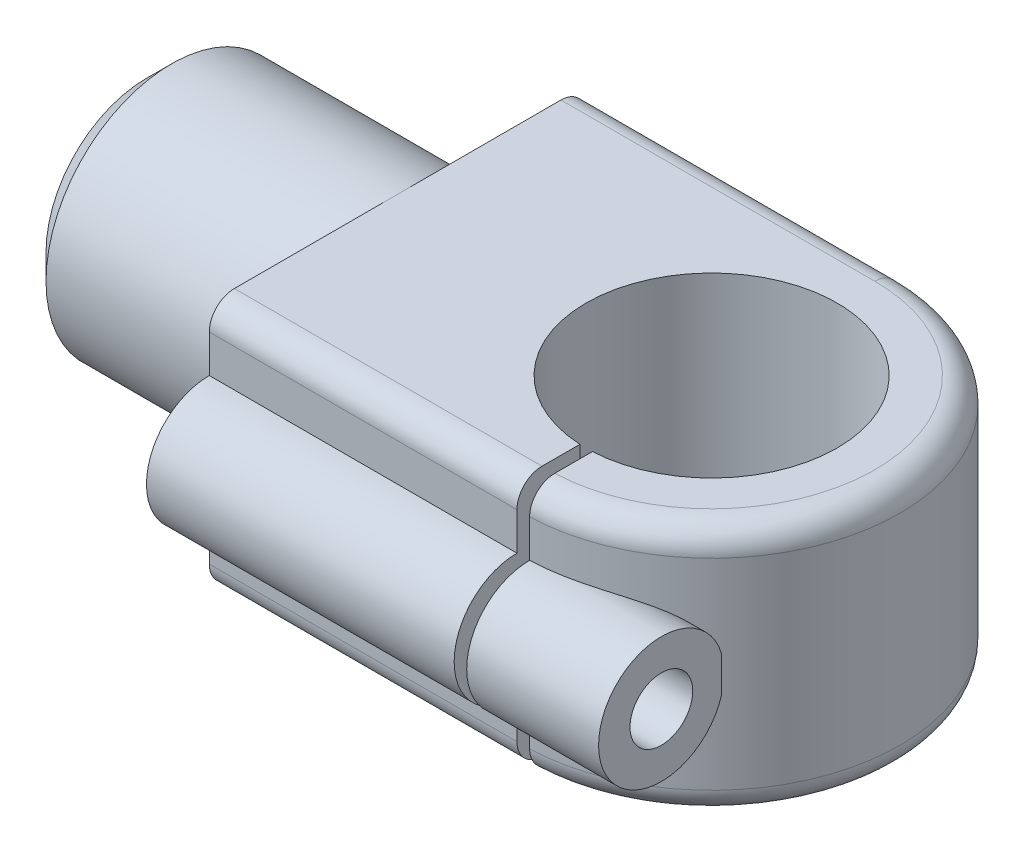
ISO-10303-21;
HEADER;
FILE_DESCRIPTION(('STEP AP214'),'2;1');
FILE_NAME('part.step','',(''),(''),'','','');
FILE_SCHEMA(('AUTOMOTIVE_DESIGN { 1 0 10303 214 1 1 1 1 }'));
ENDSEC;
DATA;
#1=APPLICATION_CONTEXT('core data for automotive mechanical design processes');
#2=APPLICATION_PROTOCOL_DEFINITION('international standard','automotive_design',2000,#1);
#3=PRODUCT_CONTEXT('',#1,'mechanical');
#4=PRODUCT('Part','Part','',(#3));
#5=PRODUCT_RELATED_PRODUCT_CATEGORY('part','',(#4));
#6=PRODUCT_DEFINITION_FORMATION('','',#4);
#7=PRODUCT_DEFINITION_CONTEXT('part definition',#1,'design');
#8=PRODUCT_DEFINITION('design','',#6,#7);
#9=PRODUCT_DEFINITION_SHAPE('','',#8);
#10=(LENGTH_UNIT() NAMED_UNIT(*) SI_UNIT(.MILLI.,.METRE.));
#11=(NAMED_UNIT(*) PLANE_ANGLE_UNIT() SI_UNIT($,.RADIAN.));
#12=(NAMED_UNIT(*) SI_UNIT($,.STERADIAN.) SOLID_ANGLE_UNIT());
#13=UNCERTAINTY_MEASURE_WITH_UNIT(LENGTH_MEASURE(1.E-05),#10,'distance_accuracy_value','');
#14=(GEOMETRIC_REPRESENTATION_CONTEXT(3) GLOBAL_UNCERTAINTY_ASSIGNED_CONTEXT((#13)) GLOBAL_UNIT_ASSIGNED_CONTEXT((#10,
#11,#12)) REPRESENTATION_CONTEXT('',''));
#15=CARTESIAN_POINT('',(0.,0.,0.));
#16=DIRECTION('',(0.,0.,1.));
#17=DIRECTION('',(1.,0.,0.));
#18=AXIS2_PLACEMENT_3D('',#15,#16,#17);
#19=CARTESIAN_POINT('',(0.,20.,0.));
#20=DIRECTION('',(0.,1.,0.));
#21=DIRECTION('',(0.,0.,1.));
#22=AXIS2_PLACEMENT_3D('',#19,#20,#21);
#23=PLANE('',#22);
#24=DIRECTION('',(0.,0.,-1.));
#25=VECTOR('',#24,1.);
#26=CARTESIAN_POINT('',(-25.,20.,0.));
#27=LINE('',#26,#25);
#28=CARTESIAN_POINT('',(-25.,20.,0.));
#29=VERTEX_POINT('',#28);
#30=CARTESIAN_POINT('',(-25.,20.,-13.));
#31=VERTEX_POINT('',#30);
#32=EDGE_CURVE('E181',#29,#31,#27,.T.);
#33=ORIENTED_EDGE('',*,*,#32,.F.);
#34=DIRECTION('',(0.,0.,-1.));
#35=VECTOR('',#34,1.);
#36=CARTESIAN_POINT('',(-25.,20.,0.));
#37=LINE('',#36,#35);
#38=CARTESIAN_POINT('',(-25.,20.,13.));
#39=VERTEX_POINT('',#38);
#40=EDGE_CURVE('E173',#39,#29,#37,.T.);
#41=ORIENTED_EDGE('',*,*,#40,.F.);
#42=DIRECTION('',(1.,0.,0.));
#43=VECTOR('',#42,1.);
#44=CARTESIAN_POINT('',(-0.5,20.,13.));
#45=LINE('',#44,#43);
#46=CARTESIAN_POINT('',(-0.5,20.,13.));
#47=VERTEX_POINT('',#46);
#48=EDGE_CURVE('E313',#39,#47,#45,.T.);
#49=ORIENTED_EDGE('',*,*,#48,.T.);
#50=DIRECTION('',(0.,0.,-1.));
#51=VECTOR('',#50,1.);
#52=CARTESIAN_POINT('',(-0.5,20.,0.));
#53=LINE('',#52,#51);
#54=CARTESIAN_POINT('',(-0.5,20.,9.98749217771909));
#55=VERTEX_POINT('',#54);
#56=EDGE_CURVE('E359',#47,#55,#53,.T.);
#57=ORIENTED_EDGE('',*,*,#56,.T.);
#58=CARTESIAN_POINT('',(0.,20.,0.));
#59=DIRECTION('',(0.,1.,0.));
#60=DIRECTION('',(0.,0.,1.));
#61=AXIS2_PLACEMENT_3D('',#58,#59,#60);
#62=CIRCLE('',#61,10.);
#63=CARTESIAN_POINT('',(0.5,20.,9.98749217771909));
#64=VERTEX_POINT('',#63);
#65=EDGE_CURVE('E363',#64,#55,#62,.T.);
#66=ORIENTED_EDGE('',*,*,#65,.F.);
#67=DIRECTION('',(0.,0.,-1.));
#68=VECTOR('',#67,1.);
#69=CARTESIAN_POINT('',(0.5,20.,0.));
#70=LINE('',#69,#68);
#71=CARTESIAN_POINT('',(0.5,20.,12.9903810567666));
#72=VERTEX_POINT('',#71);
#73=EDGE_CURVE('E361',#72,#64,#70,.T.);
#74=ORIENTED_EDGE('',*,*,#73,.F.);
#75=CARTESIAN_POINT('',(0.,20.,0.));
#76=DIRECTION('',(0.,1.,0.));
#77=DIRECTION('',(0.,0.,1.));
#78=AXIS2_PLACEMENT_3D('',#75,#76,#77);
#79=CIRCLE('',#78,13.);
#80=CARTESIAN_POINT('',(0.,20.,-13.));
#81=VERTEX_POINT('',#80);
#82=EDGE_CURVE('E306',#72,#81,#79,.T.);
#83=ORIENTED_EDGE('',*,*,#82,.T.);
#84=DIRECTION('',(-1.,0.,0.));
#85=VECTOR('',#84,1.);
#86=CARTESIAN_POINT('',(-30.,20.,-13.));
#87=LINE('',#86,#85);
#88=EDGE_CURVE('E186',#81,#31,#87,.T.);
#89=ORIENTED_EDGE('',*,*,#88,.T.);
#90=EDGE_LOOP('',(#33,#41,#49,#57,#66,#74,#83,#89));
#91=FACE_BOUND('',#90,.T.);
#92=ADVANCED_FACE('F41',(#91),#23,.T.);
#93=CARTESIAN_POINT('',(0.,0.,0.));
#94=DIRECTION('',(0.,1.,0.));
#95=DIRECTION('',(0.,0.,1.));
#96=AXIS2_PLACEMENT_3D('',#93,#94,#95);
#97=PLANE('',#96);
#98=DIRECTION('',(0.,0.,1.));
#99=VECTOR('',#98,1.);
#100=CARTESIAN_POINT('',(-25.,0.,0.));
#101=LINE('',#100,#99);
#102=CARTESIAN_POINT('',(-25.,0.,0.));
#103=VERTEX_POINT('',#102);
#104=CARTESIAN_POINT('',(-25.,0.,13.));
#105=VERTEX_POINT('',#104);
#106=EDGE_CURVE('E168',#103,#105,#101,.T.);
#107=ORIENTED_EDGE('',*,*,#106,.F.);
#108=DIRECTION('',(0.,0.,1.));
#109=VECTOR('',#108,1.);
#110=CARTESIAN_POINT('',(-25.,0.,0.));
#111=LINE('',#110,#109);
#112=CARTESIAN_POINT('',(-25.,0.,-13.));
#113=VERTEX_POINT('',#112);
#114=EDGE_CURVE('E188',#113,#103,#111,.T.);
#115=ORIENTED_EDGE('',*,*,#114,.F.);
#116=DIRECTION('',(-1.,0.,0.));
#117=VECTOR('',#116,1.);
#118=CARTESIAN_POINT('',(0.,0.,-13.));
#119=LINE('',#118,#117);
#120=CARTESIAN_POINT('',(0.,0.,-13.));
#121=VERTEX_POINT('',#120);
#122=EDGE_CURVE('E302',#113,#121,#119,.F.);
#123=ORIENTED_EDGE('',*,*,#122,.T.);
#124=CARTESIAN_POINT('',(0.,0.,0.));
#125=DIRECTION('',(0.,1.,0.));
#126=DIRECTION('',(0.,0.,1.));
#127=AXIS2_PLACEMENT_3D('',#124,#125,#126);
#128=CIRCLE('',#127,13.);
#129=CARTESIAN_POINT('',(0.5,0.,12.9903810567666));
#130=VERTEX_POINT('',#129);
#131=EDGE_CURVE('E298',#121,#130,#128,.F.);
#132=ORIENTED_EDGE('',*,*,#131,.T.);
#133=DIRECTION('',(0.,0.,-1.));
#134=VECTOR('',#133,1.);
#135=CARTESIAN_POINT('',(0.5,0.,0.));
#136=LINE('',#135,#134);
#137=CARTESIAN_POINT('',(0.5,0.,9.98749217771909));
#138=VERTEX_POINT('',#137);
#139=EDGE_CURVE('E377',#130,#138,#136,.T.);
#140=ORIENTED_EDGE('',*,*,#139,.T.);
#141=CARTESIAN_POINT('',(0.,0.,0.));
#142=DIRECTION('',(0.,1.,0.));
#143=DIRECTION('',(0.,0.,1.));
#144=AXIS2_PLACEMENT_3D('',#141,#142,#143);
#145=CIRCLE('',#144,10.);
#146=CARTESIAN_POINT('',(-0.5,0.,9.98749217771909));
#147=VERTEX_POINT('',#146);
#148=EDGE_CURVE('E385',#138,#147,#145,.T.);
#149=ORIENTED_EDGE('',*,*,#148,.T.);
#150=DIRECTION('',(0.,0.,-1.));
#151=VECTOR('',#150,1.);
#152=CARTESIAN_POINT('',(-0.5,0.,0.));
#153=LINE('',#152,#151);
#154=CARTESIAN_POINT('',(-0.5,0.,13.));
#155=VERTEX_POINT('',#154);
#156=EDGE_CURVE('E366',#155,#147,#153,.T.);
#157=ORIENTED_EDGE('',*,*,#156,.F.);
#158=DIRECTION('',(1.,0.,0.));
#159=VECTOR('',#158,1.);
#160=CARTESIAN_POINT('',(0.,0.,13.));
#161=LINE('',#160,#159);
#162=EDGE_CURVE('E301',#155,#105,#161,.F.);
#163=ORIENTED_EDGE('',*,*,#162,.T.);
#164=EDGE_LOOP('',(#107,#115,#123,#132,#140,#149,#157,#163));
#165=FACE_BOUND('',#164,.T.);
#166=ADVANCED_FACE('F246',(#165),#97,.F.);
#167=CARTESIAN_POINT('',(11.,10.,15.));
#168=DIRECTION('',(-1.,0.,0.));
#169=DIRECTION('',(0.,0.,1.));
#170=AXIS2_PLACEMENT_3D('',#167,#168,#169);
#171=CYLINDRICAL_SURFACE('',#170,5.);
#172=DIRECTION('',(-1.,0.,0.));
#173=VECTOR('',#172,1.);
#174=CARTESIAN_POINT('',(11.,15.,15.));
#175=LINE('',#174,#173);
#176=CARTESIAN_POINT('',(-25.,15.,15.));
#177=VERTEX_POINT('',#176);
#178=CARTESIAN_POINT('',(-0.5,15.,15.));
#179=VERTEX_POINT('',#178);
#180=EDGE_CURVE('E213',#177,#179,#175,.F.);
#181=ORIENTED_EDGE('',*,*,#180,.F.);
#182=CARTESIAN_POINT('',(-25.,10.,15.));
#183=DIRECTION('',(-1.,0.,0.));
#184=DIRECTION('',(0.,0.,1.));
#185=AXIS2_PLACEMENT_3D('',#182,#183,#184);
#186=CIRCLE('',#185,5.);
#187=CARTESIAN_POINT('',(-25.,5.,15.));
#188=VERTEX_POINT('',#187);
#189=EDGE_CURVE('E455',#188,#177,#186,.T.);
#190=ORIENTED_EDGE('',*,*,#189,.F.);
#191=DIRECTION('',(-1.,0.,0.));
#192=VECTOR('',#191,1.);
#193=CARTESIAN_POINT('',(11.,5.,15.));
#194=LINE('',#193,#192);
#195=CARTESIAN_POINT('',(-0.5,5.,15.));
#196=VERTEX_POINT('',#195);
#197=EDGE_CURVE('E214',#196,#188,#194,.T.);
#198=ORIENTED_EDGE('',*,*,#197,.F.);
#199=CARTESIAN_POINT('',(-0.5,10.,15.));
#200=DIRECTION('',(-1.,0.,0.));
#201=DIRECTION('',(0.,0.,1.));
#202=AXIS2_PLACEMENT_3D('',#199,#200,#201);
#203=CIRCLE('',#202,5.);
#204=EDGE_CURVE('E294',#179,#196,#203,.F.);
#205=ORIENTED_EDGE('',*,*,#204,.F.);
#206=EDGE_LOOP('',(#181,#190,#198,#205));
#207=FACE_BOUND('',#206,.T.);
#208=ADVANCED_FACE('F241',(#207),#171,.T.);
#209=CARTESIAN_POINT('',(0.,20.,15.));
#210=DIRECTION('',(0.,0.,-1.));
#211=DIRECTION('',(-1.,0.,0.));
#212=AXIS2_PLACEMENT_3D('',#209,#210,#211);
#213=PLANE('',#212);
#214=DIRECTION('',(0.,1.,0.));
#215=VECTOR('',#214,1.);
#216=CARTESIAN_POINT('',(-25.,0.,15.));
#217=LINE('',#216,#215);
#218=CARTESIAN_POINT('',(-25.,2.,15.));
#219=VERTEX_POINT('',#218);
#220=EDGE_CURVE('E454',#219,#188,#217,.T.);
#221=ORIENTED_EDGE('',*,*,#220,.F.);
#222=DIRECTION('',(1.,0.,0.));
#223=VECTOR('',#222,1.);
#224=CARTESIAN_POINT('',(0.,2.,15.));
#225=LINE('',#224,#223);
#226=CARTESIAN_POINT('',(-0.5,2.,15.));
#227=VERTEX_POINT('',#226);
#228=EDGE_CURVE('E319',#219,#227,#225,.T.);
#229=ORIENTED_EDGE('',*,*,#228,.T.);
#230=DIRECTION('',(0.,-1.,0.));
#231=VECTOR('',#230,1.);
#232=CARTESIAN_POINT('',(-0.5,20.,15.));
#233=LINE('',#232,#231);
#234=EDGE_CURVE('E371',#196,#227,#233,.T.);
#235=ORIENTED_EDGE('',*,*,#234,.F.);
#236=ORIENTED_EDGE('',*,*,#197,.T.);
#237=EDGE_LOOP('',(#221,#229,#235,#236));
#238=FACE_BOUND('',#237,.T.);
#239=ADVANCED_FACE('F265',(#238),#213,.F.);
#240=DIRECTION('',(0.,1.,0.));
#241=VECTOR('',#240,1.);
#242=CARTESIAN_POINT('',(-25.,0.,15.));
#243=LINE('',#242,#241);
#244=CARTESIAN_POINT('',(-25.,18.,15.));
#245=VERTEX_POINT('',#244);
#246=EDGE_CURVE('E459',#177,#245,#243,.T.);
#247=ORIENTED_EDGE('',*,*,#246,.F.);
#248=ORIENTED_EDGE('',*,*,#180,.T.);
#249=CARTESIAN_POINT('',(-0.5,18.,15.));
#250=VERTEX_POINT('',#249);
#251=EDGE_CURVE('E383',#250,#179,#233,.T.);
#252=ORIENTED_EDGE('',*,*,#251,.F.);
#253=DIRECTION('',(1.,0.,0.));
#254=VECTOR('',#253,1.);
#255=CARTESIAN_POINT('',(-30.,18.,15.));
#256=LINE('',#255,#254);
#257=EDGE_CURVE('E320',#250,#245,#256,.F.);
#258=ORIENTED_EDGE('',*,*,#257,.T.);
#259=EDGE_LOOP('',(#247,#248,#252,#258));
#260=FACE_BOUND('',#259,.T.);
#261=ADVANCED_FACE('F262',(#260),#213,.F.);
#262=CARTESIAN_POINT('',(0.,18.,13.));
#263=DIRECTION('',(-1.,0.,0.));
#264=DIRECTION('',(0.,0.,1.));
#265=AXIS2_PLACEMENT_3D('',#262,#263,#264);
#266=CYLINDRICAL_SURFACE('',#265,2.);
#267=ORIENTED_EDGE('',*,*,#48,.F.);
#268=CARTESIAN_POINT('',(-25.,18.,13.));
#269=DIRECTION('',(-1.,0.,0.));
#270=DIRECTION('',(0.,0.,1.));
#271=AXIS2_PLACEMENT_3D('',#268,#269,#270);
#272=CIRCLE('',#271,2.);
#273=EDGE_CURVE('E178',#245,#39,#272,.T.);
#274=ORIENTED_EDGE('',*,*,#273,.F.);
#275=ORIENTED_EDGE('',*,*,#257,.F.);
#276=CARTESIAN_POINT('',(-0.5,18.,13.));
#277=DIRECTION('',(-1.,0.,0.));
#278=DIRECTION('',(0.,0.,1.));
#279=AXIS2_PLACEMENT_3D('',#276,#277,#278);
#280=CIRCLE('',#279,2.);
#281=EDGE_CURVE('E312',#47,#250,#280,.F.);
#282=ORIENTED_EDGE('',*,*,#281,.F.);
#283=EDGE_LOOP('',(#267,#274,#275,#282));
#284=FACE_BOUND('',#283,.T.);
#285=ADVANCED_FACE('F279',(#284),#266,.T.);
#286=CARTESIAN_POINT('',(0.,2.,13.));
#287=DIRECTION('',(1.,0.,0.));
#288=DIRECTION('',(0.,0.,-1.));
#289=AXIS2_PLACEMENT_3D('',#286,#287,#288);
#290=CYLINDRICAL_SURFACE('',#289,2.);
#291=ORIENTED_EDGE('',*,*,#228,.F.);
#292=CARTESIAN_POINT('',(-25.,2.,13.));
#293=DIRECTION('',(-1.,0.,0.));
#294=DIRECTION('',(0.,0.,1.));
#295=AXIS2_PLACEMENT_3D('',#292,#293,#294);
#296=CIRCLE('',#295,2.);
#297=EDGE_CURVE('E446',#105,#219,#296,.T.);
#298=ORIENTED_EDGE('',*,*,#297,.F.);
#299=ORIENTED_EDGE('',*,*,#162,.F.);
#300=CARTESIAN_POINT('',(-0.5,2.,13.));
#301=DIRECTION('',(-1.,0.,0.));
#302=DIRECTION('',(0.,0.,1.));
#303=AXIS2_PLACEMENT_3D('',#300,#301,#302);
#304=CIRCLE('',#303,2.);
#305=EDGE_CURVE('E311',#227,#155,#304,.F.);
#306=ORIENTED_EDGE('',*,*,#305,.F.);
#307=EDGE_LOOP('',(#291,#298,#299,#306));
#308=FACE_BOUND('',#307,.T.);
#309=ADVANCED_FACE('F267',(#308),#290,.T.);
#310=CARTESIAN_POINT('',(0.,20.,-15.));
#311=DIRECTION('',(0.,0.,1.));
#312=DIRECTION('',(1.,0.,0.));
#313=AXIS2_PLACEMENT_3D('',#310,#311,#312);
#314=PLANE('',#313);
#315=DIRECTION('',(0.,-1.,0.));
#316=VECTOR('',#315,1.);
#317=CARTESIAN_POINT('',(-25.,0.,-15.));
#318=LINE('',#317,#316);
#319=CARTESIAN_POINT('',(-25.,18.,-15.));
#320=VERTEX_POINT('',#319);
#321=CARTESIAN_POINT('',(-25.,2.,-15.));
#322=VERTEX_POINT('',#321);
#323=EDGE_CURVE('E284',#320,#322,#318,.T.);
#324=ORIENTED_EDGE('',*,*,#323,.F.);
#325=DIRECTION('',(-1.,0.,0.));
#326=VECTOR('',#325,1.);
#327=CARTESIAN_POINT('',(0.,18.,-15.));
#328=LINE('',#327,#326);
#329=CARTESIAN_POINT('',(0.,18.,-15.));
#330=VERTEX_POINT('',#329);
#331=EDGE_CURVE('E281',#320,#330,#328,.F.);
#332=ORIENTED_EDGE('',*,*,#331,.T.);
#333=DIRECTION('',(0.,-1.,0.));
#334=VECTOR('',#333,1.);
#335=CARTESIAN_POINT('',(0.,20.,-15.));
#336=LINE('',#335,#334);
#337=CARTESIAN_POINT('',(0.,2.,-15.));
#338=VERTEX_POINT('',#337);
#339=EDGE_CURVE('E390',#330,#338,#336,.T.);
#340=ORIENTED_EDGE('',*,*,#339,.T.);
#341=DIRECTION('',(-1.,0.,0.));
#342=VECTOR('',#341,1.);
#343=CARTESIAN_POINT('',(0.,2.,-15.));
#344=LINE('',#343,#342);
#345=EDGE_CURVE('E289',#338,#322,#344,.T.);
#346=ORIENTED_EDGE('',*,*,#345,.T.);
#347=EDGE_LOOP('',(#324,#332,#340,#346));
#348=FACE_BOUND('',#347,.T.);
#349=ADVANCED_FACE('F266',(#348),#314,.F.);
#350=CARTESIAN_POINT('',(0.,2.,-13.));
#351=DIRECTION('',(-1.,0.,0.));
#352=DIRECTION('',(0.,0.,1.));
#353=AXIS2_PLACEMENT_3D('',#350,#351,#352);
#354=CYLINDRICAL_SURFACE('',#353,2.);
#355=ORIENTED_EDGE('',*,*,#122,.F.);
#356=CARTESIAN_POINT('',(-25.,2.,-13.));
#357=DIRECTION('',(-1.,0.,0.));
#358=DIRECTION('',(0.,0.,1.));
#359=AXIS2_PLACEMENT_3D('',#356,#357,#358);
#360=CIRCLE('',#359,2.);
#361=EDGE_CURVE('E290',#322,#113,#360,.T.);
#362=ORIENTED_EDGE('',*,*,#361,.F.);
#363=ORIENTED_EDGE('',*,*,#345,.F.);
#364=CARTESIAN_POINT('',(0.,2.,-13.));
#365=DIRECTION('',(-1.,0.,0.));
#366=DIRECTION('',(0.,-1.,0.));
#367=AXIS2_PLACEMENT_3D('',#364,#365,#366);
#368=CIRCLE('',#367,2.);
#369=EDGE_CURVE('E204',#338,#121,#368,.T.);
#370=ORIENTED_EDGE('',*,*,#369,.T.);
#371=EDGE_LOOP('',(#355,#362,#363,#370));
#372=FACE_BOUND('',#371,.T.);
#373=ADVANCED_FACE('F268',(#372),#354,.T.);
#374=CARTESIAN_POINT('',(0.,18.,-13.));
#375=DIRECTION('',(1.,0.,0.));
#376=DIRECTION('',(0.,0.,-1.));
#377=AXIS2_PLACEMENT_3D('',#374,#375,#376);
#378=CYLINDRICAL_SURFACE('',#377,2.);
#379=ORIENTED_EDGE('',*,*,#331,.F.);
#380=CARTESIAN_POINT('',(-25.,18.,-13.));
#381=DIRECTION('',(-1.,0.,0.));
#382=DIRECTION('',(0.,0.,1.));
#383=AXIS2_PLACEMENT_3D('',#380,#381,#382);
#384=CIRCLE('',#383,2.);
#385=EDGE_CURVE('E193',#31,#320,#384,.T.);
#386=ORIENTED_EDGE('',*,*,#385,.F.);
#387=ORIENTED_EDGE('',*,*,#88,.F.);
#388=CARTESIAN_POINT('',(0.,18.,-13.));
#389=DIRECTION('',(-1.,0.,0.));
#390=DIRECTION('',(0.,0.,1.));
#391=AXIS2_PLACEMENT_3D('',#388,#389,#390);
#392=CIRCLE('',#391,2.);
#393=EDGE_CURVE('E192',#81,#330,#392,.T.);
#394=ORIENTED_EDGE('',*,*,#393,.T.);
#395=EDGE_LOOP('',(#379,#386,#387,#394));
#396=FACE_BOUND('',#395,.T.);
#397=ADVANCED_FACE('F274',(#396),#378,.T.);
#398=CARTESIAN_POINT('',(0.5,20.,0.));
#399=DIRECTION('',(-1.,0.,0.));
#400=DIRECTION('',(0.,0.,1.));
#401=AXIS2_PLACEMENT_3D('',#398,#399,#400);
#402=PLANE('',#401);
#403=CARTESIAN_POINT('',(0.5,10.,15.));
#404=DIRECTION('',(-1.,0.,0.));
#405=DIRECTION('',(0.,0.,1.));
#406=AXIS2_PLACEMENT_3D('',#403,#404,#405);
#407=CIRCLE('',#406,2.5);
#408=CARTESIAN_POINT('',(0.5,10.,17.5));
#409=VERTEX_POINT('',#408);
#410=EDGE_CURVE('E210',#409,#409,#407,.T.);
#411=ORIENTED_EDGE('',*,*,#410,.F.);
#412=EDGE_LOOP('',(#411));
#413=FACE_BOUND('',#412,.T.);
#414=ORIENTED_EDGE('',*,*,#139,.F.);
#415=CARTESIAN_POINT('',(0.5,0.,12.9903810567666));
#416=CARTESIAN_POINT('',(0.5,3.9474154008824E-07,13.0467150452053));
#417=CARTESIAN_POINT('',(0.5,0.00237810851266362,13.103022076195));
#418=CARTESIAN_POINT('',(0.5,0.0118641897622879,13.215233562011));
#419=CARTESIAN_POINT('',(0.5,0.0189723412082146,13.2711380351036));
#420=CARTESIAN_POINT('',(0.5,0.0473260310628624,13.4375517851217));
#421=CARTESIAN_POINT('',(0.5,0.0756009864726571,13.5469468675122));
#422=CARTESIAN_POINT('',(0.5,0.150116828889387,13.759434911907));
#423=CARTESIAN_POINT('',(0.5,0.196366540729273,13.8625247494893));
#424=CARTESIAN_POINT('',(0.5,0.305518473808404,14.0594686849897));
#425=CARTESIAN_POINT('',(0.5,0.36841763608513,14.1533244751162));
#426=CARTESIAN_POINT('',(0.5,0.5090593195644,14.329096210817));
#427=CARTESIAN_POINT('',(0.5,0.586795865286165,14.4110169396758));
#428=CARTESIAN_POINT('',(0.5,0.754945090825614,14.5606526498705));
#429=CARTESIAN_POINT('',(0.5,0.845360238454905,14.6283648591851));
#430=CARTESIAN_POINT('',(0.5,1.03623337964804,14.7476054138702));
#431=CARTESIAN_POINT('',(0.5,1.13668716525642,14.7991405030972));
#432=CARTESIAN_POINT('',(0.5,1.34480385558574,14.8845781561183));
#433=CARTESIAN_POINT('',(0.5,1.45246243486213,14.9184911941124));
#434=CARTESIAN_POINT('',(0.5,1.63398864538022,14.9592514641663));
#435=CARTESIAN_POINT('',(0.5,1.70671025517,14.9713989770526));
#436=CARTESIAN_POINT('',(0.5,1.85294436952205,14.9876043045346));
#437=CARTESIAN_POINT('',(0.5,1.92645560245249,14.9916735975551));
#438=CARTESIAN_POINT('',(0.5,2.,14.9916643505649));
#439=B_SPLINE_CURVE_WITH_KNOTS('',3,(#415,#416,#417,#418,#419,#420,#421,#422,#423,#424,#425,
#426,#427,#428,#429,#430,#431,#432,#433,#434,#435,#436,#437,#438),.UNSPECIFIED.,.F.,.F.,(4,2,2,
2,2,2,2,2,2,2,2,4),(0.,0.168898237005139,0.337788761189665,0.675020464450288,1.01241794356334,
1.34975347644329,1.6869534392658,2.02421912732002,2.36134403003656,2.69826832248159,
2.91903835864936,3.13949447525757),.UNSPECIFIED.);
#440=CARTESIAN_POINT('',(0.5,2.,14.9916643505649));
#441=VERTEX_POINT('',#440);
#442=EDGE_CURVE('E57',#130,#441,#439,.T.);
#443=ORIENTED_EDGE('',*,*,#442,.T.);
#444=DIRECTION('',(0.,-1.,0.));
#445=VECTOR('',#444,1.);
#446=CARTESIAN_POINT('',(0.5,20.,14.9916643505649));
#447=LINE('',#446,#445);
#448=CARTESIAN_POINT('',(0.5,5.00000694830998,14.9916643505649));
#449=VERTEX_POINT('',#448);
#450=EDGE_CURVE('E386',#449,#441,#447,.T.);
#451=ORIENTED_EDGE('',*,*,#450,.F.);
#452=CARTESIAN_POINT('',(0.5,10.,15.));
#453=DIRECTION('',(1.,0.,0.));
#454=DIRECTION('',(0.,0.,-1.));
#455=AXIS2_PLACEMENT_3D('',#452,#453,#454);
#456=CIRCLE('',#455,5.);
#457=CARTESIAN_POINT('',(0.5,14.99999305169,14.9916643505649));
#458=VERTEX_POINT('',#457);
#459=EDGE_CURVE('E297',#449,#458,#456,.F.);
#460=ORIENTED_EDGE('',*,*,#459,.T.);
#461=CARTESIAN_POINT('',(0.5,18.,14.9916643505649));
#462=VERTEX_POINT('',#461);
#463=EDGE_CURVE('E388',#462,#458,#447,.T.);
#464=ORIENTED_EDGE('',*,*,#463,.F.);
#465=CARTESIAN_POINT('',(0.5,18.,14.9916643505649));
#466=CARTESIAN_POINT('',(0.5,18.0562458452927,14.9916639907305));
#467=CARTESIAN_POINT('',(0.5,18.1124647375663,14.9892888442767));
#468=CARTESIAN_POINT('',(0.5,18.2245000733079,14.9798135164011));
#469=CARTESIAN_POINT('',(0.5,18.2803165363377,14.972713566235));
#470=CARTESIAN_POINT('',(0.5,18.446463335016,14.9443944045545));
#471=CARTESIAN_POINT('',(0.5,18.5556804990266,14.9161556921597));
#472=CARTESIAN_POINT('',(0.5,18.7678202509978,14.8417448931838));
#473=CARTESIAN_POINT('',(0.5,18.8707398204714,14.7955642836472));
#474=CARTESIAN_POINT('',(0.5,19.0673647936057,14.6865882800202));
#475=CARTESIAN_POINT('',(0.5,19.161071780253,14.6237957472038));
#476=CARTESIAN_POINT('',(0.5,19.3366358835915,14.4833643720356));
#477=CARTESIAN_POINT('',(0.5,19.4184904393927,14.4057223296166));
#478=CARTESIAN_POINT('',(0.5,19.5680285447651,14.2377863166749));
#479=CARTESIAN_POINT('',(0.5,19.6357093140392,14.147489869681));
#480=CARTESIAN_POINT('',(0.5,19.7550060054429,13.9567638848156));
#481=CARTESIAN_POINT('',(0.5,19.8066101889012,13.8563270132114));
#482=CARTESIAN_POINT('',(0.5,19.892209745537,13.6482382207818));
#483=CARTESIAN_POINT('',(0.5,19.9262152415467,13.5405904880104));
#484=CARTESIAN_POINT('',(0.5,19.9672507114245,13.358639679444));
#485=CARTESIAN_POINT('',(0.5,19.9795244441603,13.2854760528088));
#486=CARTESIAN_POINT('',(0.5,19.9958980361735,13.1383454462529));
#487=CARTESIAN_POINT('',(0.5,20.0000094992786,13.0643797573145));
#488=CARTESIAN_POINT('',(0.5,20.,12.9903810567666));
#489=B_SPLINE_CURVE_WITH_KNOTS('',3,(#465,#466,#467,#468,#469,#470,#471,#472,#473,#474,#475,
#476,#477,#478,#479,#480,#481,#482,#483,#484,#485,#486,#487,#488),.UNSPECIFIED.,.F.,.F.,(4,2,2,
2,2,2,2,2,2,2,2,4),(0.,0.168633868792142,0.337259484403116,0.67394969371288,1.01080003721426,
1.34759239860703,1.68445742064833,2.02138845958609,2.35856494259508,2.69554726423919,
2.9176809505185,3.13949861536405),.UNSPECIFIED.);
#490=EDGE_CURVE('E324',#462,#72,#489,.T.);
#491=ORIENTED_EDGE('',*,*,#490,.T.);
#492=ORIENTED_EDGE('',*,*,#73,.T.);
#493=DIRECTION('',(0.,-1.,0.));
#494=VECTOR('',#493,1.);
#495=CARTESIAN_POINT('',(0.5,20.,9.98749217771909));
#496=LINE('',#495,#494);
#497=EDGE_CURVE('E375',#64,#138,#496,.T.);
#498=ORIENTED_EDGE('',*,*,#497,.T.);
#499=EDGE_LOOP('',(#414,#443,#451,#460,#464,#491,#492,#498));
#500=FACE_BOUND('',#499,.T.);
#501=ADVANCED_FACE('F337',(#413,#500),#402,.T.);
#502=CARTESIAN_POINT('',(0.,20.,0.));
#503=DIRECTION('',(0.,-1.,0.));
#504=DIRECTION('',(0.,0.,-1.));
#505=AXIS2_PLACEMENT_3D('',#502,#503,#504);
#506=CYLINDRICAL_SURFACE('',#505,15.);
#507=ORIENTED_EDGE('',*,*,#450,.T.);
#508=CARTESIAN_POINT('',(0.,2.,0.));
#509=DIRECTION('',(0.,1.,0.));
#510=DIRECTION('',(0.,0.,1.));
#511=AXIS2_PLACEMENT_3D('',#508,#509,#510);
#512=CIRCLE('',#511,15.);
#513=EDGE_CURVE('E323',#441,#338,#512,.T.);
#514=ORIENTED_EDGE('',*,*,#513,.T.);
#515=ORIENTED_EDGE('',*,*,#339,.F.);
#516=CARTESIAN_POINT('',(0.,18.,0.));
#517=DIRECTION('',(0.,1.,0.));
#518=DIRECTION('',(0.,0.,1.));
#519=AXIS2_PLACEMENT_3D('',#516,#517,#518);
#520=CIRCLE('',#519,15.);
#521=EDGE_CURVE('E65',#330,#462,#520,.F.);
#522=ORIENTED_EDGE('',*,*,#521,.T.);
#523=ORIENTED_EDGE('',*,*,#463,.T.);
#524=CARTESIAN_POINT('',(0.499999999999998,14.99999305169,14.9916643505649));
#525=CARTESIAN_POINT('',(0.709016176793523,14.9999570179221,14.9846960287137));
#526=CARTESIAN_POINT('',(0.917886394684518,14.9999471171306,14.9733510948819));
#527=CARTESIAN_POINT('',(1.33497382201988,14.9996940938068,14.9419396582291));
#528=CARTESIAN_POINT('',(1.54319101897098,14.9994509668395,14.9218729895613));
#529=CARTESIAN_POINT('',(1.9588562142638,14.9984453713524,14.8730202852095));
#530=CARTESIAN_POINT('',(2.16630296749293,14.9976822709062,14.844223663634));
#531=CARTESIAN_POINT('',(2.57980178239071,14.9951783835352,14.7779722324026));
#532=CARTESIAN_POINT('',(2.78585385810368,14.9934376064704,14.7405175100673));
#533=CARTESIAN_POINT('',(3.19819516434935,14.9883731536167,14.6566109459529));
#534=CARTESIAN_POINT('',(3.40446709098063,14.985034198444,14.6100748808715));
#535=CARTESIAN_POINT('',(3.81481113810398,14.9760302908913,14.5083389126559));
#536=CARTESIAN_POINT('',(4.01888329159912,14.9703653734574,14.4531391396967));
#537=CARTESIAN_POINT('',(4.42427238311351,14.9558397156679,14.3342386894659));
#538=CARTESIAN_POINT('',(4.62559113995534,14.9469812024119,14.2705439557314));
#539=CARTESIAN_POINT('',(5.02513455266006,14.9250534449839,14.1347987390139));
#540=CARTESIAN_POINT('',(5.22335957805687,14.9119847078051,14.0627492627735));
#541=CARTESIAN_POINT('',(5.65405436948396,14.877444671145,13.8958541208507));
#542=CARTESIAN_POINT('',(5.88577329280607,14.8548403589024,13.799289776119));
#543=CARTESIAN_POINT('',(6.34312287736273,14.7997408708904,13.5951275102535));
#544=CARTESIAN_POINT('',(6.56875358722205,14.7672457741414,13.4875296772739));
#545=CARTESIAN_POINT('',(7.01191480126644,14.6899133231455,13.2625254057557));
#546=CARTESIAN_POINT('',(7.2294710935807,14.64511995351,13.1451549420483));
#547=CARTESIAN_POINT('',(7.65575921460111,14.5402661904725,12.901532346789));
#548=CARTESIAN_POINT('',(7.86449399259669,14.4802109474141,12.7752832218465));
#549=CARTESIAN_POINT('',(8.21239614868667,14.361730623622,12.5533258163752));
#550=CARTESIAN_POINT('',(8.3542214976592,14.307858889113,12.4593467048967));
#551=CARTESIAN_POINT('',(8.6316130328255,14.1896467718256,12.2688037579691));
#552=CARTESIAN_POINT('',(8.76718094588151,14.1253092997167,12.1722406473872));
#553=CARTESIAN_POINT('',(9.03108644937174,13.9850113374701,11.9777423288579));
#554=CARTESIAN_POINT('',(9.15942721054837,13.9090559996162,11.8798077465345));
#555=CARTESIAN_POINT('',(9.40777696362126,13.7445078119889,11.6841250559839));
#556=CARTESIAN_POINT('',(9.52778837516228,13.6559186553294,11.5863769016924));
#557=CARTESIAN_POINT('',(9.81828557879378,13.415481458649,11.3425417167022));
#558=CARTESIAN_POINT('',(9.98266406219497,13.2546556643525,11.1976799460142));
#559=CARTESIAN_POINT('',(10.2089978522316,12.9891511711846,10.9903122397402));
#560=CARTESIAN_POINT('',(10.2810259377435,12.8966799743779,10.9228884000276));
#561=CARTESIAN_POINT('',(10.4178792804636,12.7036908774226,10.7924362078745));
#562=CARTESIAN_POINT('',(10.4827088610998,12.6031778702971,10.7294052256439));
#563=CARTESIAN_POINT('',(10.5920537224786,12.4159008305681,10.6213485052129));
#564=CARTESIAN_POINT('',(10.6380035770999,12.3305658260404,10.5752873034074));
#565=CARTESIAN_POINT('',(10.7247442635333,12.1552822369841,10.4873099890451));
#566=CARTESIAN_POINT('',(10.7655364988054,12.0653349169353,10.4453927495386));
#567=CARTESIAN_POINT('',(10.8419505586862,11.8806215129413,10.3660585040188));
#568=CARTESIAN_POINT('',(10.8775404208349,11.7858301047225,10.3286695412744));
#569=CARTESIAN_POINT('',(10.9430720355563,11.5923393369412,10.2592121376307));
#570=CARTESIAN_POINT('',(10.9730095855129,11.4936371350721,10.2271476577168));
#571=CARTESIAN_POINT('',(11.,11.393259062618,10.1980390271856));
#572=B_SPLINE_CURVE_WITH_KNOTS('',3,(#524,#525,#526,#527,#528,#529,#530,#531,#532,#533,#534,
#535,#536,#537,#538,#539,#540,#541,#542,#543,#544,#545,#546,#547,#548,#549,#550,#551,#552,#553,
#554,#555,#556,#557,#558,#559,#560,#561,#562,#563,#564,#565,#566,#567,#568,#569,#570,#571),
.UNSPECIFIED.,.F.,.F.,(4,2,2,2,2,2,2,2,2,2,2,2,2,2,2,2,2,2,2,2,2,2,2,4),(0.,0.627351182839175,
1.25471429550598,1.88284120880964,2.51096178747135,3.14521124727079,3.77945117817742,
4.41324966566169,5.04697185993519,5.80264759521503,6.55831729334522,7.31131878473383,
8.06406650135722,8.59907478034048,9.13393451955992,9.66855774359114,10.2030250058538,
11.0147156487105,11.4199831358448,11.8250058871594,12.146653328004,12.4682130548674,
12.7916720925342,13.1153706899558),.UNSPECIFIED.);
#573=CARTESIAN_POINT('',(11.,11.393259062618,10.1980390271856));
#574=VERTEX_POINT('',#573);
#575=EDGE_CURVE('E229',#458,#574,#572,.T.);
#576=ORIENTED_EDGE('',*,*,#575,.T.);
#577=DIRECTION('',(0.,-1.,0.));
#578=VECTOR('',#577,1.);
#579=CARTESIAN_POINT('',(11.,20.,10.1980390271856));
#580=LINE('',#579,#578);
#581=CARTESIAN_POINT('',(11.,8.60674093738201,10.1980390271856));
#582=VERTEX_POINT('',#581);
#583=EDGE_CURVE('E394',#582,#574,#580,.F.);
#584=ORIENTED_EDGE('',*,*,#583,.F.);
#585=CARTESIAN_POINT('',(11.,8.60674093738201,10.1980390271856));
#586=CARTESIAN_POINT('',(10.9681497892336,8.48826272321655,10.2323863539468));
#587=CARTESIAN_POINT('',(10.932190206325,8.37213914079519,10.2708589859221));
#588=CARTESIAN_POINT('',(10.8524541258747,8.1454851723718,10.3550778741438));
#589=CARTESIAN_POINT('',(10.8086857787056,8.03494910732818,10.4008165410863));
#590=CARTESIAN_POINT('',(10.7140727344312,7.82102380215299,10.4982472347182));
#591=CARTESIAN_POINT('',(10.6632917615689,7.71758152243639,10.5498849977407));
#592=CARTESIAN_POINT('',(10.554802369404,7.51731456320768,10.6584266153143));
#593=CARTESIAN_POINT('',(10.4970924009117,7.42049137121827,10.7153316468711));
#594=CARTESIAN_POINT('',(10.3147273225745,7.14127811918767,10.8919607390469));
#595=CARTESIAN_POINT('',(10.180377402778,6.96911664533216,11.018082642827));
#596=CARTESIAN_POINT('',(9.88946641976325,6.65284353287973,11.2799300277889));
#597=CARTESIAN_POINT('',(9.73285801474437,6.50879327525164,11.4156756611451));
#598=CARTESIAN_POINT('',(9.44132568279479,6.27901233707514,11.6571071263238));
#599=CARTESIAN_POINT('',(9.31027113223434,6.18759308986831,11.7621535470754));
#600=CARTESIAN_POINT('',(9.0389819072277,6.018960082979,11.9718918915287));
#601=CARTESIAN_POINT('',(8.89874324610567,5.94175254853555,12.076583640255));
#602=CARTESIAN_POINT('',(8.61023794467512,5.80013542434358,12.2839495590363));
#603=CARTESIAN_POINT('',(8.46196029366693,5.73574398213745,12.3866206852386));
#604=CARTESIAN_POINT('',(8.15863133954971,5.61842215863648,12.5884855965981));
#605=CARTESIAN_POINT('',(8.00357774300767,5.56549569453292,12.6876781835864));
#606=CARTESIAN_POINT('',(7.60029162671509,5.44317309345108,12.9351567808342));
#607=CARTESIAN_POINT('',(7.34794500720837,5.3808530367901,13.0802597443766));
#608=CARTESIAN_POINT('',(6.8320789283882,5.27534464189535,13.3569663084387));
#609=CARTESIAN_POINT('',(6.56855310817671,5.23216736020464,13.4885620737991));
#610=CARTESIAN_POINT('',(6.03168279694908,5.16039893841299,13.7370518981262));
#611=CARTESIAN_POINT('',(5.75830803182962,5.13185777353219,13.8538945724558));
#612=CARTESIAN_POINT('',(5.20437357040663,5.08573892950674,14.0713558665211));
#613=CARTESIAN_POINT('',(4.92381480367087,5.06815983932227,14.1719765731141));
#614=CARTESIAN_POINT('',(4.30495720531859,5.03820201646626,14.3732987468962));
#615=CARTESIAN_POINT('',(3.9654916205032,5.0273647023064,14.4706419993681));
#616=CARTESIAN_POINT('',(3.28032470688919,5.0121564536333,14.6411794097721));
#617=CARTESIAN_POINT('',(2.93462195234975,5.00778701704974,14.7143679705438));
#618=CARTESIAN_POINT('',(2.41442660409066,5.00369825792366,14.805444816789));
#619=CARTESIAN_POINT('',(2.24151677739333,5.00274510392516,14.8326072582638));
#620=CARTESIAN_POINT('',(1.89484202076948,5.00136059695042,14.8808667206037));
#621=CARTESIAN_POINT('',(1.72107708931378,5.00092924490766,14.9019637306181));
#622=CARTESIAN_POINT('',(1.37298565445021,5.0003505220372,14.9380559701495));
#623=CARTESIAN_POINT('',(1.19865939916693,5.00020303943225,14.9530535995406));
#624=CARTESIAN_POINT('',(0.849589806107389,5.00004198982749,14.976942644913));
#625=CARTESIAN_POINT('',(0.67484647041621,5.0000284221596,14.9858340913566));
#626=CARTESIAN_POINT('',(0.499999999999999,5.00000694830998,14.9916643505649));
#627=B_SPLINE_CURVE_WITH_KNOTS('',3,(#585,#586,#587,#588,#589,#590,#591,#592,#593,#594,#595,
#596,#597,#598,#599,#600,#601,#602,#603,#604,#605,#606,#607,#608,#609,#610,#611,#612,#613,#614,
#615,#616,#617,#618,#619,#620,#621,#622,#623,#624,#625,#626),.UNSPECIFIED.,.F.,.F.,(4,2,2,2,2,2,
2,2,2,2,2,2,2,2,2,2,2,2,2,2,4),(0.,0.381979245321956,0.763562108926435,1.14188137228921,
1.52028537859572,2.27346392738061,3.02826908255637,3.60117513507879,4.17433154685419,
4.74829386082581,5.32245196988107,6.21409795220185,7.10625826536677,8.0014449208999,
8.89651632407983,9.95546632784239,11.0146615410397,11.5396720904539,12.0646835790892,
12.5894882953806,13.1142903935326),.UNSPECIFIED.);
#628=EDGE_CURVE('E217',#582,#449,#627,.T.);
#629=ORIENTED_EDGE('',*,*,#628,.T.);
#630=EDGE_LOOP('',(#507,#514,#515,#522,#523,#576,#584,#629));
#631=FACE_BOUND('',#630,.T.);
#632=ADVANCED_FACE('F232',(#631),#506,.T.);
#633=CARTESIAN_POINT('',(-0.5,20.,0.));
#634=DIRECTION('',(-1.,0.,0.));
#635=DIRECTION('',(0.,0.,1.));
#636=AXIS2_PLACEMENT_3D('',#633,#634,#635);
#637=PLANE('',#636);
#638=CARTESIAN_POINT('',(-0.5,10.,15.));
#639=DIRECTION('',(-1.,0.,0.));
#640=DIRECTION('',(0.,0.,1.));
#641=AXIS2_PLACEMENT_3D('',#638,#639,#640);
#642=CIRCLE('',#641,2.5);
#643=CARTESIAN_POINT('',(-0.5,10.,17.5));
#644=VERTEX_POINT('',#643);
#645=EDGE_CURVE('E199',#644,#644,#642,.T.);
#646=ORIENTED_EDGE('',*,*,#645,.T.);
#647=EDGE_LOOP('',(#646));
#648=FACE_BOUND('',#647,.T.);
#649=ORIENTED_EDGE('',*,*,#56,.F.);
#650=ORIENTED_EDGE('',*,*,#281,.T.);
#651=ORIENTED_EDGE('',*,*,#251,.T.);
#652=ORIENTED_EDGE('',*,*,#204,.T.);
#653=ORIENTED_EDGE('',*,*,#234,.T.);
#654=ORIENTED_EDGE('',*,*,#305,.T.);
#655=ORIENTED_EDGE('',*,*,#156,.T.);
#656=DIRECTION('',(0.,-1.,0.));
#657=VECTOR('',#656,1.);
#658=CARTESIAN_POINT('',(-0.5,20.,9.98749217771909));
#659=LINE('',#658,#657);
#660=EDGE_CURVE('E368',#55,#147,#659,.T.);
#661=ORIENTED_EDGE('',*,*,#660,.F.);
#662=EDGE_LOOP('',(#649,#650,#651,#652,#653,#654,#655,#661));
#663=FACE_BOUND('',#662,.T.);
#664=ADVANCED_FACE('F260',(#648,#663),#637,.F.);
#665=CARTESIAN_POINT('',(0.,20.,0.));
#666=DIRECTION('',(0.,-1.,0.));
#667=DIRECTION('',(0.,0.,-1.));
#668=AXIS2_PLACEMENT_3D('',#665,#666,#667);
#669=CYLINDRICAL_SURFACE('',#668,10.);
#670=ORIENTED_EDGE('',*,*,#148,.F.);
#671=ORIENTED_EDGE('',*,*,#497,.F.);
#672=ORIENTED_EDGE('',*,*,#65,.T.);
#673=ORIENTED_EDGE('',*,*,#660,.T.);
#674=EDGE_LOOP('',(#670,#671,#672,#673));
#675=FACE_BOUND('',#674,.T.);
#676=ADVANCED_FACE('F255',(#675),#669,.F.);
#677=CARTESIAN_POINT('',(11.,10.,15.));
#678=DIRECTION('',(-1.,0.,0.));
#679=DIRECTION('',(0.,0.,1.));
#680=AXIS2_PLACEMENT_3D('',#677,#678,#679);
#681=PLANE('',#680);
#682=CARTESIAN_POINT('',(11.,10.,15.));
#683=DIRECTION('',(1.,0.,0.));
#684=DIRECTION('',(0.,0.,-1.));
#685=AXIS2_PLACEMENT_3D('',#682,#683,#684);
#686=CIRCLE('',#685,2.5);
#687=CARTESIAN_POINT('',(11.,10.,12.5));
#688=VERTEX_POINT('',#687);
#689=EDGE_CURVE('E203',#688,#688,#686,.T.);
#690=ORIENTED_EDGE('',*,*,#689,.F.);
#691=EDGE_LOOP('',(#690));
#692=FACE_BOUND('',#691,.T.);
#693=CARTESIAN_POINT('',(11.,10.,15.));
#694=DIRECTION('',(-1.,0.,0.));
#695=DIRECTION('',(0.,0.,1.));
#696=AXIS2_PLACEMENT_3D('',#693,#694,#695);
#697=CIRCLE('',#696,5.);
#698=EDGE_CURVE('E209',#582,#574,#697,.T.);
#699=ORIENTED_EDGE('',*,*,#698,.F.);
#700=ORIENTED_EDGE('',*,*,#583,.T.);
#701=EDGE_LOOP('',(#699,#700));
#702=FACE_BOUND('',#701,.T.);
#703=ADVANCED_FACE('F242',(#692,#702),#681,.F.);
#704=ORIENTED_EDGE('',*,*,#575,.F.);
#705=ORIENTED_EDGE('',*,*,#459,.F.);
#706=ORIENTED_EDGE('',*,*,#628,.F.);
#707=ORIENTED_EDGE('',*,*,#698,.T.);
#708=EDGE_LOOP('',(#704,#705,#706,#707));
#709=FACE_BOUND('',#708,.T.);
#710=ADVANCED_FACE('F240',(#709),#171,.T.);
#711=CARTESIAN_POINT('',(-20.,10.,15.));
#712=DIRECTION('',(1.,0.,0.));
#713=DIRECTION('',(0.,0.,-1.));
#714=AXIS2_PLACEMENT_3D('',#711,#712,#713);
#715=CYLINDRICAL_SURFACE('',#714,2.5);
#716=ORIENTED_EDGE('',*,*,#410,.T.);
#717=EDGE_LOOP('',(#716));
#718=FACE_BOUND('',#717,.T.);
#719=ORIENTED_EDGE('',*,*,#689,.T.);
#720=EDGE_LOOP('',(#719));
#721=FACE_BOUND('',#720,.T.);
#722=ADVANCED_FACE('F244',(#718,#721),#715,.F.);
#723=CARTESIAN_POINT('',(-20.,10.,15.));
#724=DIRECTION('',(1.,0.,0.));
#725=DIRECTION('',(0.,0.,-1.));
#726=AXIS2_PLACEMENT_3D('',#723,#724,#725);
#727=CIRCLE('',#726,2.5);
#728=CARTESIAN_POINT('',(-20.,10.,12.5));
#729=VERTEX_POINT('',#728);
#730=EDGE_CURVE('E197',#729,#729,#727,.T.);
#731=ORIENTED_EDGE('',*,*,#730,.F.);
#732=EDGE_LOOP('',(#731));
#733=FACE_BOUND('',#732,.T.);
#734=ORIENTED_EDGE('',*,*,#645,.F.);
#735=EDGE_LOOP('',(#734));
#736=FACE_BOUND('',#735,.T.);
#737=ADVANCED_FACE('F409',(#733,#736),#715,.F.);
#738=CARTESIAN_POINT('',(-20.,10.,15.));
#739=DIRECTION('',(1.,0.,0.));
#740=DIRECTION('',(0.,0.,-1.));
#741=AXIS2_PLACEMENT_3D('',#738,#739,#740);
#742=PLANE('',#741);
#743=ORIENTED_EDGE('',*,*,#730,.T.);
#744=EDGE_LOOP('',(#743));
#745=FACE_BOUND('',#744,.T.);
#746=ADVANCED_FACE('F414',(#745),#742,.T.);
#747=CARTESIAN_POINT('',(0.,2.,0.));
#748=DIRECTION('',(0.,1.,0.));
#749=DIRECTION('',(0.,0.,1.));
#750=AXIS2_PLACEMENT_3D('',#747,#748,#749);
#751=TOROIDAL_SURFACE('',#750,13.,2.);
#752=ORIENTED_EDGE('',*,*,#442,.F.);
#753=ORIENTED_EDGE('',*,*,#131,.F.);
#754=ORIENTED_EDGE('',*,*,#369,.F.);
#755=ORIENTED_EDGE('',*,*,#513,.F.);
#756=EDGE_LOOP('',(#752,#753,#754,#755));
#757=FACE_BOUND('',#756,.T.);
#758=ADVANCED_FACE('F341',(#757),#751,.T.);
#759=CARTESIAN_POINT('',(0.,18.,0.));
#760=DIRECTION('',(0.,1.,0.));
#761=DIRECTION('',(0.,0.,1.));
#762=AXIS2_PLACEMENT_3D('',#759,#760,#761);
#763=TOROIDAL_SURFACE('',#762,13.,2.);
#764=ORIENTED_EDGE('',*,*,#490,.F.);
#765=ORIENTED_EDGE('',*,*,#521,.F.);
#766=ORIENTED_EDGE('',*,*,#393,.F.);
#767=ORIENTED_EDGE('',*,*,#82,.F.);
#768=EDGE_LOOP('',(#764,#765,#766,#767));
#769=FACE_BOUND('',#768,.T.);
#770=ADVANCED_FACE('F336',(#769),#763,.T.);
#771=CARTESIAN_POINT('',(-45.,10.,0.));
#772=DIRECTION('',(1.,0.,0.));
#773=DIRECTION('',(0.,0.,-1.));
#774=AXIS2_PLACEMENT_3D('',#771,#772,#773);
#775=CYLINDRICAL_SURFACE('',#774,10.);
#776=CARTESIAN_POINT('',(-43.,10.,0.));
#777=DIRECTION('',(-1.,0.,0.));
#778=DIRECTION('',(0.,0.,1.));
#779=AXIS2_PLACEMENT_3D('',#776,#777,#778);
#780=CIRCLE('',#779,10.);
#781=CARTESIAN_POINT('',(-43.,10.,10.));
#782=VERTEX_POINT('',#781);
#783=EDGE_CURVE('E11',#782,#782,#780,.F.);
#784=ORIENTED_EDGE('',*,*,#783,.T.);
#785=EDGE_LOOP('',(#784));
#786=FACE_BOUND('',#785,.T.);
#787=CARTESIAN_POINT('',(-25.,10.,0.));
#788=DIRECTION('',(-1.,0.,0.));
#789=DIRECTION('',(0.,0.,1.));
#790=AXIS2_PLACEMENT_3D('',#787,#788,#789);
#791=CIRCLE('',#790,10.);
#792=EDGE_CURVE('E167',#29,#103,#791,.T.);
#793=ORIENTED_EDGE('',*,*,#792,.T.);
#794=CARTESIAN_POINT('',(-25.,10.,0.));
#795=DIRECTION('',(-1.,0.,0.));
#796=DIRECTION('',(0.,0.,1.));
#797=AXIS2_PLACEMENT_3D('',#794,#795,#796);
#798=CIRCLE('',#797,10.);
#799=EDGE_CURVE('E165',#29,#103,#798,.F.);
#800=ORIENTED_EDGE('',*,*,#799,.F.);
#801=EDGE_LOOP('',(#793,#800));
#802=FACE_BOUND('',#801,.T.);
#803=ADVANCED_FACE('F163',(#786,#802),#775,.T.);
#804=CARTESIAN_POINT('',(-45.,10.,0.));
#805=DIRECTION('',(-1.,0.,0.));
#806=DIRECTION('',(0.,0.,1.));
#807=AXIS2_PLACEMENT_3D('',#804,#805,#806);
#808=PLANE('',#807);
#809=CARTESIAN_POINT('',(-45.,10.,0.));
#810=DIRECTION('',(-1.,0.,0.));
#811=DIRECTION('',(0.,0.,1.));
#812=AXIS2_PLACEMENT_3D('',#809,#810,#811);
#813=CIRCLE('',#812,8.00000000000001);
#814=CARTESIAN_POINT('',(-45.,10.,8.00000000000001));
#815=VERTEX_POINT('',#814);
#816=EDGE_CURVE('E47',#815,#815,#813,.T.);
#817=ORIENTED_EDGE('',*,*,#816,.T.);
#818=EDGE_LOOP('',(#817));
#819=FACE_BOUND('',#818,.T.);
#820=ADVANCED_FACE('F419',(#819),#808,.T.);
#821=CARTESIAN_POINT('',(-25.,0.,0.));
#822=DIRECTION('',(-1.,0.,0.));
#823=DIRECTION('',(0.,0.,1.));
#824=AXIS2_PLACEMENT_3D('',#821,#822,#823);
#825=PLANE('',#824);
#826=ORIENTED_EDGE('',*,*,#323,.T.);
#827=ORIENTED_EDGE('',*,*,#361,.T.);
#828=ORIENTED_EDGE('',*,*,#114,.T.);
#829=ORIENTED_EDGE('',*,*,#792,.F.);
#830=ORIENTED_EDGE('',*,*,#32,.T.);
#831=ORIENTED_EDGE('',*,*,#385,.T.);
#832=EDGE_LOOP('',(#826,#827,#828,#829,#830,#831));
#833=FACE_BOUND('',#832,.T.);
#834=ADVANCED_FACE('F185',(#833),#825,.T.);
#835=CARTESIAN_POINT('',(-25.,0.,0.));
#836=DIRECTION('',(-1.,0.,0.));
#837=DIRECTION('',(0.,0.,1.));
#838=AXIS2_PLACEMENT_3D('',#835,#836,#837);
#839=PLANE('',#838);
#840=ORIENTED_EDGE('',*,*,#40,.T.);
#841=ORIENTED_EDGE('',*,*,#799,.T.);
#842=ORIENTED_EDGE('',*,*,#106,.T.);
#843=ORIENTED_EDGE('',*,*,#297,.T.);
#844=ORIENTED_EDGE('',*,*,#220,.T.);
#845=ORIENTED_EDGE('',*,*,#189,.T.);
#846=ORIENTED_EDGE('',*,*,#246,.T.);
#847=ORIENTED_EDGE('',*,*,#273,.T.);
#848=EDGE_LOOP('',(#840,#841,#842,#843,#844,#845,#846,#847));
#849=FACE_BOUND('',#848,.T.);
#850=ADVANCED_FACE('F175',(#849),#839,.T.);
#851=CARTESIAN_POINT('',(-45.,10.,0.));
#852=DIRECTION('',(1.,0.,0.));
#853=DIRECTION('',(0.,0.,-1.));
#854=AXIS2_PLACEMENT_3D('',#851,#852,#853);
#855=CONICAL_SURFACE('',#854,8.00000000000001,0.785398163397446);
#856=ORIENTED_EDGE('',*,*,#783,.F.);
#857=EDGE_LOOP('',(#856));
#858=FACE_BOUND('',#857,.T.);
#859=ORIENTED_EDGE('',*,*,#816,.F.);
#860=EDGE_LOOP('',(#859));
#861=FACE_BOUND('',#860,.T.);
#862=ADVANCED_FACE('F43',(#858,#861),#855,.T.);
#863=CLOSED_SHELL('',(#92,#166,#208,#239,#261,#285,#309,#349,#373,#397,#501,#632,#664,#676,#703,
#710,#722,#737,#746,#758,#770,#803,#820,#834,#850,#862));
#864=MANIFOLD_SOLID_BREP('B2',#863);
#865=ADVANCED_BREP_SHAPE_REPRESENTATION('',(#18,#864),#14);
#866=SHAPE_DEFINITION_REPRESENTATION(#9,#865);
ENDSEC;
END-ISO-10303-21;
